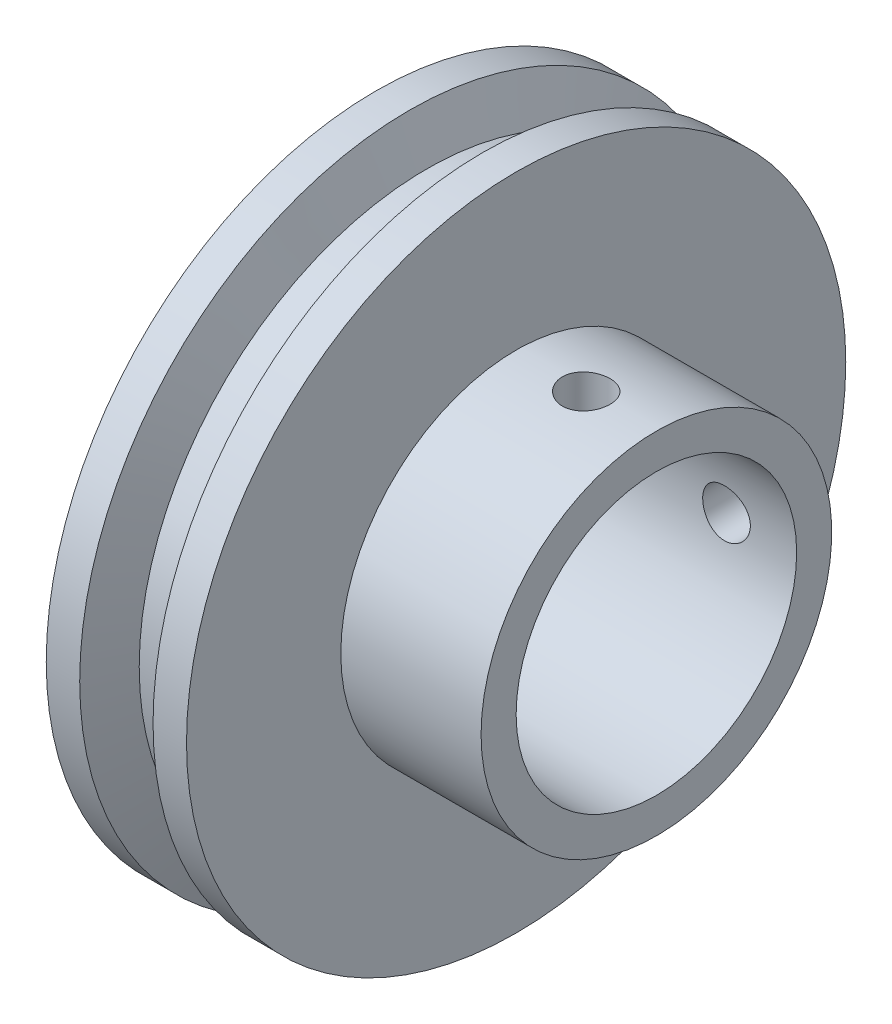
ISO-10303-21;
HEADER;
FILE_DESCRIPTION(('STEP AP214'),'2;1');
FILE_NAME('part.step','',(''),(''),'','','');
FILE_SCHEMA(('AUTOMOTIVE_DESIGN { 1 0 10303 214 1 1 1 1 }'));
ENDSEC;
DATA;
#1=APPLICATION_CONTEXT('core data for automotive mechanical design processes');
#2=APPLICATION_PROTOCOL_DEFINITION('international standard','automotive_design',2000,#1);
#3=PRODUCT_CONTEXT('',#1,'mechanical');
#4=PRODUCT('Part','Part','',(#3));
#5=PRODUCT_RELATED_PRODUCT_CATEGORY('part','',(#4));
#6=PRODUCT_DEFINITION_FORMATION('','',#4);
#7=PRODUCT_DEFINITION_CONTEXT('part definition',#1,'design');
#8=PRODUCT_DEFINITION('design','',#6,#7);
#9=PRODUCT_DEFINITION_SHAPE('','',#8);
#10=(LENGTH_UNIT() NAMED_UNIT(*) SI_UNIT(.MILLI.,.METRE.));
#11=(NAMED_UNIT(*) PLANE_ANGLE_UNIT() SI_UNIT($,.RADIAN.));
#12=(NAMED_UNIT(*) SI_UNIT($,.STERADIAN.) SOLID_ANGLE_UNIT());
#13=UNCERTAINTY_MEASURE_WITH_UNIT(LENGTH_MEASURE(1.E-05),#10,'distance_accuracy_value','');
#14=(GEOMETRIC_REPRESENTATION_CONTEXT(3) GLOBAL_UNCERTAINTY_ASSIGNED_CONTEXT((#13)) GLOBAL_UNIT_ASSIGNED_CONTEXT((#10,
#11,#12)) REPRESENTATION_CONTEXT('',''));
#15=CARTESIAN_POINT('',(0.,0.,0.));
#16=DIRECTION('',(0.,0.,1.));
#17=DIRECTION('',(1.,0.,0.));
#18=AXIS2_PLACEMENT_3D('',#15,#16,#17);
#19=CARTESIAN_POINT('',(-5.,0.,0.));
#20=DIRECTION('',(-1.,0.,0.));
#21=DIRECTION('',(0.,0.,1.));
#22=AXIS2_PLACEMENT_3D('',#19,#20,#21);
#23=CYLINDRICAL_SURFACE('',#22,12.5);
#24=CARTESIAN_POINT('',(5.,0.,0.));
#25=DIRECTION('',(-1.,0.,0.));
#26=DIRECTION('',(0.,0.,1.));
#27=AXIS2_PLACEMENT_3D('',#24,#25,#26);
#28=CIRCLE('',#27,12.5);
#29=CARTESIAN_POINT('',(5.,0.,12.5));
#30=VERTEX_POINT('',#29);
#31=EDGE_CURVE('E81',#30,#30,#28,.T.);
#32=ORIENTED_EDGE('',*,*,#31,.F.);
#33=EDGE_LOOP('',(#32));
#34=FACE_BOUND('',#33,.T.);
#35=CARTESIAN_POINT('',(15.,0.,0.));
#36=DIRECTION('',(-1.,0.,0.));
#37=DIRECTION('',(0.,0.,1.));
#38=AXIS2_PLACEMENT_3D('',#35,#36,#37);
#39=CIRCLE('',#38,12.5);
#40=CARTESIAN_POINT('',(15.,0.,12.5));
#41=VERTEX_POINT('',#40);
#42=EDGE_CURVE('E10',#41,#41,#39,.T.);
#43=ORIENTED_EDGE('',*,*,#42,.T.);
#44=EDGE_LOOP('',(#43));
#45=FACE_BOUND('',#44,.T.);
#46=CARTESIAN_POINT('',(8.3,12.5,0.));
#47=CARTESIAN_POINT('',(8.30000399049848,12.4999985824937,0.0950193693737276));
#48=CARTESIAN_POINT('',(8.30799335860235,12.4989051524507,0.190096346810551));
#49=CARTESIAN_POINT('',(8.33973558100916,12.4946484420949,0.377599668031956));
#50=CARTESIAN_POINT('',(8.36350443099154,12.4914830614891,0.470023222755469));
#51=CARTESIAN_POINT('',(8.42608811753651,12.4834386800685,0.649478453993376));
#52=CARTESIAN_POINT('',(8.46489230343678,12.4785608925101,0.736513896810582));
#53=CARTESIAN_POINT('',(8.55642067336079,12.4676327325641,0.902822437619667));
#54=CARTESIAN_POINT('',(8.60914266070609,12.461582545259,0.982096757862897));
#55=CARTESIAN_POINT('',(8.72737428453399,12.4489401706774,1.1311609905647));
#56=CARTESIAN_POINT('',(8.79295610205747,12.4423450516135,1.20089340927839));
#57=CARTESIAN_POINT('',(8.93489058333537,12.4293794703064,1.32839884646826));
#58=CARTESIAN_POINT('',(9.01124382407019,12.4230090201206,1.38617122388536));
#59=CARTESIAN_POINT('',(9.17293294201966,12.4111854302546,1.48833501602162));
#60=CARTESIAN_POINT('',(9.25830363935377,12.4057360746105,1.53267179858357));
#61=CARTESIAN_POINT('',(9.43536596920943,12.3964109917819,1.60635685826283));
#62=CARTESIAN_POINT('',(9.5270573184181,12.3925351941187,1.63570580669007));
#63=CARTESIAN_POINT('',(9.71355783465852,12.3868244616918,1.67840568904312));
#64=CARTESIAN_POINT('',(9.80834424651759,12.3849770693856,1.69185431515497));
#65=CARTESIAN_POINT('',(9.99884518965241,12.3834943395339,1.70267423628677));
#66=CARTESIAN_POINT('',(10.0945596767459,12.3838588971968,1.70004629293772));
#67=CARTESIAN_POINT('',(10.2835151005745,12.3867474777825,1.6788677145159));
#68=CARTESIAN_POINT('',(10.3767684103706,12.389256838664,1.66042518638892));
#69=CARTESIAN_POINT('',(10.5588443269562,12.3961294042073,1.60830986035059));
#70=CARTESIAN_POINT('',(10.647666828938,12.4004926526983,1.5746367023588));
#71=CARTESIAN_POINT('',(10.8186927336821,12.4105978157081,1.49290135454795));
#72=CARTESIAN_POINT('',(10.900873649633,12.4163441716624,1.44479268408234));
#73=CARTESIAN_POINT('',(11.0560369845013,12.4285647481879,1.33558512659794));
#74=CARTESIAN_POINT('',(11.1290189056233,12.4350390081132,1.27448553706776));
#75=CARTESIAN_POINT('',(11.264339663579,12.4480509280862,1.14043378959507));
#76=CARTESIAN_POINT('',(11.3265863165472,12.4545886726739,1.06738854593132));
#77=CARTESIAN_POINT('',(11.4379501383685,12.4669414130603,0.911838118562529));
#78=CARTESIAN_POINT('',(11.4870672666848,12.4727564066275,0.829332905651349));
#79=CARTESIAN_POINT('',(11.5707797967884,12.483013039657,0.657129787303394));
#80=CARTESIAN_POINT('',(11.6053688667713,12.4874540800839,0.567428765939401));
#81=CARTESIAN_POINT('',(11.6589673436249,12.4944571938052,0.383417754602683));
#82=CARTESIAN_POINT('',(11.6779776148745,12.4970193713461,0.289108020648868));
#83=CARTESIAN_POINT('',(11.6997580896896,12.4999624166332,0.0993531437377582));
#84=CARTESIAN_POINT('',(11.7026551736488,12.5003603259693,0.0039228185657198));
#85=CARTESIAN_POINT('',(11.6924626868127,12.4989761709545,-0.186062088343098));
#86=CARTESIAN_POINT('',(11.6793735206688,12.4971941617827,-0.280616692185505));
#87=CARTESIAN_POINT('',(11.6376855428029,12.4916609697489,-0.465787556296886));
#88=CARTESIAN_POINT('',(11.6091477811237,12.4879175399217,-0.556417812371648));
#89=CARTESIAN_POINT('',(11.537436545087,12.478880270856,-0.731606674242915));
#90=CARTESIAN_POINT('',(11.4942624921698,12.47358637033,-0.816165039862857));
#91=CARTESIAN_POINT('',(11.3942011480688,12.4619950790423,-0.977372840274132));
#92=CARTESIAN_POINT('',(11.3372324452297,12.455691809023,-1.05397131280997));
#93=CARTESIAN_POINT('',(11.211313337348,12.4428038405337,-1.19656515527526));
#94=CARTESIAN_POINT('',(11.1423623653937,12.4362191287592,-1.26256002323669));
#95=CARTESIAN_POINT('',(10.9938745408483,12.4234572170661,-1.38252830907401));
#96=CARTESIAN_POINT('',(10.9142691068428,12.4172830816708,-1.43641721633323));
#97=CARTESIAN_POINT('',(10.7470621534232,12.4060934325306,-1.53005854518823));
#98=CARTESIAN_POINT('',(10.6594608185572,12.4010778920545,-1.56981129294775));
#99=CARTESIAN_POINT('',(10.4790127566732,12.3927947776081,-1.63391747298213));
#100=CARTESIAN_POINT('',(10.3861827355514,12.3895219509384,-1.65831722146991));
#101=CARTESIAN_POINT('',(10.1976952821839,12.3850802367668,-1.69117325627899));
#102=CARTESIAN_POINT('',(10.1020380081,12.3839112317988,-1.69963043274914));
#103=CARTESIAN_POINT('',(9.9114527750082,12.383813359009,-1.700342891897));
#104=CARTESIAN_POINT('',(9.81652529481145,12.3848661289696,-1.69273097999287));
#105=CARTESIAN_POINT('',(9.6293129579314,12.3890535297788,-1.66180397404756));
#106=CARTESIAN_POINT('',(9.53702809980375,12.3921881594894,-1.63848888858925));
#107=CARTESIAN_POINT('',(9.35774624949746,12.4001800965892,-1.57686121095054));
#108=CARTESIAN_POINT('',(9.27074659781941,12.4050365290199,-1.53855623507272));
#109=CARTESIAN_POINT('',(9.10438783045148,12.415926146482,-1.44804917472723));
#110=CARTESIAN_POINT('',(9.02502887946664,12.4219593568718,-1.39584679077453));
#111=CARTESIAN_POINT('',(8.87552693820758,12.4345823449606,-1.27853812678783));
#112=CARTESIAN_POINT('',(8.80546177668758,12.4411761460865,-1.21333308331975));
#113=CARTESIAN_POINT('',(8.6772188219195,12.4541426300155,-1.07207782751908));
#114=CARTESIAN_POINT('',(8.6190438167913,12.4605152606662,-0.996025078592911));
#115=CARTESIAN_POINT('',(8.51600454347844,12.4723535628891,-0.834836006102763));
#116=CARTESIAN_POINT('',(8.47120129412887,12.4778150281094,-0.749660381447641));
#117=CARTESIAN_POINT('',(8.3966005793095,12.4871737590591,-0.572963876241478));
#118=CARTESIAN_POINT('',(8.36678712612197,12.4910726904407,-0.481449875112424));
#119=CARTESIAN_POINT('',(8.32999391075147,12.4959478797449,-0.324573117820288));
#120=CARTESIAN_POINT('',(8.31876278159852,12.4974598558217,-0.260191415281782));
#121=CARTESIAN_POINT('',(8.30376449010305,12.4994863982821,-0.130548868797499));
#122=CARTESIAN_POINT('',(8.29999725811908,12.5000009739719,-0.0652880330601411));
#123=CARTESIAN_POINT('',(8.3,12.5,0.));
#124=B_SPLINE_CURVE_WITH_KNOTS('',3,(#46,#47,#48,#49,#50,#51,#52,#53,#54,#55,#56,#57,#58,#59,
#60,#61,#62,#63,#64,#65,#66,#67,#68,#69,#70,#71,#72,#73,#74,#75,#76,#77,#78,#79,#80,#81,#82,#83,
#84,#85,#86,#87,#88,#89,#90,#91,#92,#93,#94,#95,#96,#97,#98,#99,#100,#101,#102,#103,#104,#105,
#106,#107,#108,#109,#110,#111,#112,#113,#114,#115,#116,#117,#118,#119,#120,#121,#122,#123),
.UNSPECIFIED.,.T.,.F.,(4,2,2,2,2,2,2,2,2,2,2,2,2,2,2,2,2,2,2,2,2,2,2,2,2,2,2,2,2,2,2,2,2,2,2,2,
2,2,4),(0.,0.284819593615374,0.569928350955831,0.854835512412448,1.13969773317749,
1.42620715431877,1.71273192841171,2.00040660874572,2.2880684029073,2.57395345239703,
2.85982495812473,3.14375771237637,3.42769717967764,3.71256089230601,3.9974400134613,
4.28465522208686,4.57187131746729,4.85921246147866,5.14653766148729,5.43159713304084,
5.71664938918519,6.00058330751292,6.2845284508043,6.57019204001725,6.8558691483845,
7.14348251733644,7.43108924975161,7.71782413052424,8.00454300106439,8.2889015208947,
8.57325988530359,8.85747395558084,9.1416941510832,9.42816158283327,9.71469611138848,
10.0025188538507,10.2900339575411,10.4857359988361,10.6814362141364),.UNSPECIFIED.);
#125=CARTESIAN_POINT('',(8.3,12.5,0.));
#126=VERTEX_POINT('',#125);
#127=EDGE_CURVE('E59',#126,#126,#124,.T.);
#128=ORIENTED_EDGE('',*,*,#127,.F.);
#129=EDGE_LOOP('',(#128));
#130=FACE_BOUND('',#129,.T.);
#131=CARTESIAN_POINT('',(8.3,0.,-12.5));
#132=CARTESIAN_POINT('',(8.30000399049848,0.0950193693736839,-12.4999985824937));
#133=CARTESIAN_POINT('',(8.30799335860235,0.190096346810508,-12.4989051524507));
#134=CARTESIAN_POINT('',(8.33973558100916,0.377599668031913,-12.4946484420949));
#135=CARTESIAN_POINT('',(8.36350443099154,0.470023222755425,-12.4914830614891));
#136=CARTESIAN_POINT('',(8.42608811753651,0.649478453993333,-12.4834386800686));
#137=CARTESIAN_POINT('',(8.46489230343678,0.736513896810538,-12.4785608925101));
#138=CARTESIAN_POINT('',(8.55642067336079,0.902822437619623,-12.4676327325641));
#139=CARTESIAN_POINT('',(8.60914266070609,0.982096757862853,-12.461582545259));
#140=CARTESIAN_POINT('',(8.72737428453399,1.13116099056465,-12.4489401706774));
#141=CARTESIAN_POINT('',(8.79295610205747,1.20089340927835,-12.4423450516135));
#142=CARTESIAN_POINT('',(8.93489058333536,1.32839884646821,-12.4293794703064));
#143=CARTESIAN_POINT('',(9.01124382407019,1.38617122388531,-12.4230090201206));
#144=CARTESIAN_POINT('',(9.17293294201966,1.48833501602158,-12.4111854302546));
#145=CARTESIAN_POINT('',(9.25830363935377,1.53267179858353,-12.4057360746105));
#146=CARTESIAN_POINT('',(9.43536596920943,1.60635685826279,-12.3964109917819));
#147=CARTESIAN_POINT('',(9.5270573184181,1.63570580669003,-12.3925351941188));
#148=CARTESIAN_POINT('',(9.71355783465852,1.67840568904308,-12.3868244616918));
#149=CARTESIAN_POINT('',(9.80834424651759,1.69185431515493,-12.3849770693856));
#150=CARTESIAN_POINT('',(9.9988451896524,1.70267423628673,-12.3834943395339));
#151=CARTESIAN_POINT('',(10.0945596767459,1.70004629293768,-12.3838588971968));
#152=CARTESIAN_POINT('',(10.2835151005745,1.67886771451586,-12.3867474777825));
#153=CARTESIAN_POINT('',(10.3767684103706,1.66042518638888,-12.389256838664));
#154=CARTESIAN_POINT('',(10.5588443269562,1.60830986035055,-12.3961294042073));
#155=CARTESIAN_POINT('',(10.647666828938,1.57463670235876,-12.4004926526983));
#156=CARTESIAN_POINT('',(10.8186927336821,1.49290135454791,-12.4105978157081));
#157=CARTESIAN_POINT('',(10.900873649633,1.44479268408229,-12.4163441716624));
#158=CARTESIAN_POINT('',(11.0560369845013,1.33558512659789,-12.4285647481879));
#159=CARTESIAN_POINT('',(11.1290189056233,1.27448553706772,-12.4350390081132));
#160=CARTESIAN_POINT('',(11.264339663579,1.14043378959502,-12.4480509280862));
#161=CARTESIAN_POINT('',(11.3265863165472,1.06738854593127,-12.454588672674));
#162=CARTESIAN_POINT('',(11.4379501383685,0.911838118562487,-12.4669414130603));
#163=CARTESIAN_POINT('',(11.4870672666848,0.829332905651306,-12.4727564066275));
#164=CARTESIAN_POINT('',(11.5707797967884,0.65712978730335,-12.483013039657));
#165=CARTESIAN_POINT('',(11.6053688667713,0.567428765939358,-12.4874540800839));
#166=CARTESIAN_POINT('',(11.6589673436249,0.383417754602639,-12.4944571938052));
#167=CARTESIAN_POINT('',(11.6779776148745,0.289108020648824,-12.4970193713461));
#168=CARTESIAN_POINT('',(11.6997580896896,0.0993531437377132,-12.4999624166332));
#169=CARTESIAN_POINT('',(11.7026551736488,0.00392281856567479,-12.5003603259693));
#170=CARTESIAN_POINT('',(11.6924626868127,-0.186062088343143,-12.4989761709545));
#171=CARTESIAN_POINT('',(11.6793735206688,-0.280616692185549,-12.4971941617827));
#172=CARTESIAN_POINT('',(11.6376855428029,-0.46578755629693,-12.4916609697489));
#173=CARTESIAN_POINT('',(11.6091477811237,-0.556417812371693,-12.4879175399217));
#174=CARTESIAN_POINT('',(11.537436545087,-0.731606674242959,-12.478880270856));
#175=CARTESIAN_POINT('',(11.4942624921698,-0.816165039862902,-12.47358637033));
#176=CARTESIAN_POINT('',(11.3942011480688,-0.977372840274176,-12.4619950790423));
#177=CARTESIAN_POINT('',(11.3372324452297,-1.05397131281001,-12.455691809023));
#178=CARTESIAN_POINT('',(11.211313337348,-1.19656515527531,-12.4428038405337));
#179=CARTESIAN_POINT('',(11.1423623653937,-1.26256002323674,-12.4362191287591));
#180=CARTESIAN_POINT('',(10.9938745408483,-1.38252830907405,-12.4234572170661));
#181=CARTESIAN_POINT('',(10.9142691068428,-1.43641721633328,-12.4172830816708));
#182=CARTESIAN_POINT('',(10.7470621534232,-1.53005854518827,-12.4060934325306));
#183=CARTESIAN_POINT('',(10.6594608185572,-1.56981129294779,-12.4010778920545));
#184=CARTESIAN_POINT('',(10.4790127566732,-1.63391747298217,-12.3927947776081));
#185=CARTESIAN_POINT('',(10.3861827355514,-1.65831722146996,-12.3895219509384));
#186=CARTESIAN_POINT('',(10.1976952821839,-1.69117325627904,-12.3850802367668));
#187=CARTESIAN_POINT('',(10.1020380081,-1.69963043274918,-12.3839112317988));
#188=CARTESIAN_POINT('',(9.9114527750082,-1.70034289189704,-12.383813359009));
#189=CARTESIAN_POINT('',(9.81652529481145,-1.69273097999291,-12.3848661289696));
#190=CARTESIAN_POINT('',(9.6293129579314,-1.6618039740476,-12.3890535297788));
#191=CARTESIAN_POINT('',(9.53702809980375,-1.63848888858929,-12.3921881594894));
#192=CARTESIAN_POINT('',(9.35774624949746,-1.57686121095058,-12.4001800965892));
#193=CARTESIAN_POINT('',(9.27074659781941,-1.53855623507276,-12.4050365290199));
#194=CARTESIAN_POINT('',(9.10438783045148,-1.44804917472727,-12.415926146482));
#195=CARTESIAN_POINT('',(9.02502887946664,-1.39584679077457,-12.4219593568718));
#196=CARTESIAN_POINT('',(8.87552693820758,-1.27853812678787,-12.4345823449606));
#197=CARTESIAN_POINT('',(8.80546177668758,-1.21333308331979,-12.4411761460865));
#198=CARTESIAN_POINT('',(8.6772188219195,-1.07207782751913,-12.4541426300155));
#199=CARTESIAN_POINT('',(8.6190438167913,-0.996025078592954,-12.4605152606662));
#200=CARTESIAN_POINT('',(8.51600454347844,-0.834836006102806,-12.4723535628891));
#201=CARTESIAN_POINT('',(8.47120129412887,-0.749660381447683,-12.4778150281094));
#202=CARTESIAN_POINT('',(8.3966005793095,-0.57296387624152,-12.4871737590591));
#203=CARTESIAN_POINT('',(8.36678712612197,-0.481449875112467,-12.4910726904407));
#204=CARTESIAN_POINT('',(8.32999391075147,-0.324573117820331,-12.4959478797449));
#205=CARTESIAN_POINT('',(8.31876278159852,-0.260191415281826,-12.4974598558216));
#206=CARTESIAN_POINT('',(8.30376449010305,-0.130548868797543,-12.4994863982821));
#207=CARTESIAN_POINT('',(8.29999725811908,-0.0652880330601849,-12.5000009739719));
#208=CARTESIAN_POINT('',(8.3,0.,-12.5));
#209=B_SPLINE_CURVE_WITH_KNOTS('',3,(#131,#132,#133,#134,#135,#136,#137,#138,#139,#140,#141,
#142,#143,#144,#145,#146,#147,#148,#149,#150,#151,#152,#153,#154,#155,#156,#157,#158,#159,#160,
#161,#162,#163,#164,#165,#166,#167,#168,#169,#170,#171,#172,#173,#174,#175,#176,#177,#178,#179,
#180,#181,#182,#183,#184,#185,#186,#187,#188,#189,#190,#191,#192,#193,#194,#195,#196,#197,#198,
#199,#200,#201,#202,#203,#204,#205,#206,#207,#208),.UNSPECIFIED.,.T.,.F.,(4,2,2,2,2,2,2,2,2,2,2,
2,2,2,2,2,2,2,2,2,2,2,2,2,2,2,2,2,2,2,2,2,2,2,2,2,2,2,4),(0.,0.284819593615374,0.56992835095583,
0.854835512412448,1.13969773317749,1.42620715431877,1.71273192841171,2.00040660874572,
2.2880684029073,2.57395345239702,2.85982495812473,3.14375771237638,3.42769717967765,
3.71256089230601,3.9974400134613,4.28465522208686,4.57187131746729,4.85921246147867,
5.14653766148729,5.43159713304084,5.71664938918519,6.00058330751292,6.2845284508043,
6.57019204001726,6.8558691483845,7.14348251733644,7.43108924975162,7.71782413052424,
8.00454300106439,8.28890152089471,8.5732598853036,8.85747395558085,9.1416941510832,
9.42816158283327,9.71469611138848,10.0025188538507,10.2900339575411,10.4857359988361,
10.6814362141364),.UNSPECIFIED.);
#210=CARTESIAN_POINT('',(8.3,0.,-12.5));
#211=VERTEX_POINT('',#210);
#212=EDGE_CURVE('E60',#211,#211,#209,.T.);
#213=ORIENTED_EDGE('',*,*,#212,.F.);
#214=EDGE_LOOP('',(#213));
#215=FACE_BOUND('',#214,.T.);
#216=ADVANCED_FACE('F32',(#34,#45,#130,#215),#23,.T.);
#217=CARTESIAN_POINT('',(-5.,0.,0.));
#218=DIRECTION('',(-1.,0.,0.));
#219=DIRECTION('',(0.,0.,1.));
#220=AXIS2_PLACEMENT_3D('',#217,#218,#219);
#221=CYLINDRICAL_SURFACE('',#220,10.);
#222=CARTESIAN_POINT('',(15.,0.,0.));
#223=DIRECTION('',(-1.,0.,0.));
#224=DIRECTION('',(0.,0.,1.));
#225=AXIS2_PLACEMENT_3D('',#222,#223,#224);
#226=CIRCLE('',#225,10.);
#227=CARTESIAN_POINT('',(15.,0.,10.));
#228=VERTEX_POINT('',#227);
#229=EDGE_CURVE('E45',#228,#228,#226,.T.);
#230=ORIENTED_EDGE('',*,*,#229,.F.);
#231=EDGE_LOOP('',(#230));
#232=FACE_BOUND('',#231,.T.);
#233=CARTESIAN_POINT('',(-5.,0.,0.));
#234=DIRECTION('',(-1.,0.,0.));
#235=DIRECTION('',(0.,0.,1.));
#236=AXIS2_PLACEMENT_3D('',#233,#234,#235);
#237=CIRCLE('',#236,10.);
#238=CARTESIAN_POINT('',(-5.,0.,10.));
#239=VERTEX_POINT('',#238);
#240=EDGE_CURVE('E50',#239,#239,#237,.T.);
#241=ORIENTED_EDGE('',*,*,#240,.T.);
#242=EDGE_LOOP('',(#241));
#243=FACE_BOUND('',#242,.T.);
#244=CARTESIAN_POINT('',(8.3,10.,0.));
#245=CARTESIAN_POINT('',(8.30000377426823,9.99999835850477,-0.0947576878946056));
#246=CARTESIAN_POINT('',(8.3079494293732,9.99863913653262,-0.189566391791717));
#247=CARTESIAN_POINT('',(8.33950779581301,9.99334783512617,-0.376522793597835));
#248=CARTESIAN_POINT('',(8.36313473363319,9.98941341945108,-0.468667995816794));
#249=CARTESIAN_POINT('',(8.4253200785672,9.97941284762061,-0.647565634171713));
#250=CARTESIAN_POINT('',(8.46386607640266,9.97334846350343,-0.734322482783481));
#251=CARTESIAN_POINT('',(8.55476244084402,9.95975405257941,-0.900126684803734));
#252=CARTESIAN_POINT('',(8.60711129965871,9.95222418588187,-0.979174878995802));
#253=CARTESIAN_POINT('',(8.72468015800242,9.93644939291957,-1.12811339489271));
#254=CARTESIAN_POINT('',(8.79001042782126,9.92819870569956,-1.19791607072673));
#255=CARTESIAN_POINT('',(8.93145028967449,9.91195606359551,-1.32562484199451));
#256=CARTESIAN_POINT('',(9.00756057528767,9.90396412539988,-1.38353017137327));
#257=CARTESIAN_POINT('',(9.16900471159843,9.88908804024087,-1.48615381918915));
#258=CARTESIAN_POINT('',(9.25439464291669,9.88221133503736,-1.53078508643947));
#259=CARTESIAN_POINT('',(9.43159610594252,9.87042444664235,-1.60503692511557));
#260=CARTESIAN_POINT('',(9.52340718532692,9.86551412509698,-1.63465855265173));
#261=CARTESIAN_POINT('',(9.70991431831559,9.85827341734443,-1.67777332304485));
#262=CARTESIAN_POINT('',(9.80457437839511,9.85591880382118,-1.69141802151836));
#263=CARTESIAN_POINT('',(9.99486742648253,9.85398286044504,-1.70266159018217));
#264=CARTESIAN_POINT('',(10.0905003423385,9.8544013264024,-1.70026164178552));
#265=CARTESIAN_POINT('',(10.2789401126245,9.85794215005271,-1.67960740432418));
#266=CARTESIAN_POINT('',(10.3717662886004,9.86103541731158,-1.66152368158915));
#267=CARTESIAN_POINT('',(10.553047603891,9.86953175017027,-1.6102830462488));
#268=CARTESIAN_POINT('',(10.641502587653,9.87493489790323,-1.57712559765967));
#269=CARTESIAN_POINT('',(10.8120394633763,9.88747346302157,-1.49650673760764));
#270=CARTESIAN_POINT('',(10.8940873626616,9.89461738721263,-1.44897479731416));
#271=CARTESIAN_POINT('',(11.0491073586138,9.90982670315991,-1.34100625557331));
#272=CARTESIAN_POINT('',(11.1220786930608,9.91789217219545,-1.2805685715006));
#273=CARTESIAN_POINT('',(11.2578612153225,9.93416346380999,-1.14757629513502));
#274=CARTESIAN_POINT('',(11.320529165259,9.94236975461281,-1.07487542689003));
#275=CARTESIAN_POINT('',(11.4327985550483,9.95790194047775,-0.91991440278867));
#276=CARTESIAN_POINT('',(11.482399904278,9.96522782943365,-0.837654180639252));
#277=CARTESIAN_POINT('',(11.5671423471008,9.97818481552786,-0.665772592595595));
#278=CARTESIAN_POINT('',(11.6022704457055,9.98381438839473,-0.576144697761933));
#279=CARTESIAN_POINT('',(11.6569344968132,9.99273228163516,-0.392144072691742));
#280=CARTESIAN_POINT('',(11.6764718070531,9.9960208058782,-0.297771756388137));
#281=CARTESIAN_POINT('',(11.6992047217622,9.99985857062862,-0.108195402995362));
#282=CARTESIAN_POINT('',(11.7025969038369,10.0004407604978,-0.0130155823423568));
#283=CARTESIAN_POINT('',(11.6934678440613,9.99889062262385,0.176552208617399));
#284=CARTESIAN_POINT('',(11.6809472401301,9.99675840369713,0.270940210514254));
#285=CARTESIAN_POINT('',(11.6405115192946,9.9900394441558,0.455635354346481));
#286=CARTESIAN_POINT('',(11.612694051989,9.98546827833647,0.545964490519939));
#287=CARTESIAN_POINT('',(11.5425585774746,9.97438190041171,0.720677070626036));
#288=CARTESIAN_POINT('',(11.5002397288841,9.96786657550744,0.805060169222212));
#289=CARTESIAN_POINT('',(11.4018548591597,9.95353279680435,0.966336947941809));
#290=CARTESIAN_POINT('',(11.3456664517532,9.94570295183439,1.04315493575005));
#291=CARTESIAN_POINT('',(11.2213053793328,9.92964218696026,1.18634178293015));
#292=CARTESIAN_POINT('',(11.1531318063952,9.92141123670495,1.25270984995668));
#293=CARTESIAN_POINT('',(11.0058526439188,9.90536897279411,1.37384438851324));
#294=CARTESIAN_POINT('',(10.9266369481539,9.89756315078007,1.42847783237172));
#295=CARTESIAN_POINT('',(10.7600369358385,9.88335868818869,1.52366227424996));
#296=CARTESIAN_POINT('',(10.6726528858138,9.87696000172068,1.56421373154811));
#297=CARTESIAN_POINT('',(10.4925634017548,9.86633579141612,1.62988570006916));
#298=CARTESIAN_POINT('',(10.3998823886925,9.86210106805335,1.65507162400974));
#299=CARTESIAN_POINT('',(10.2115270724541,9.85626147937876,1.68950285881336));
#300=CARTESIAN_POINT('',(10.1158530418926,9.8546563752585,1.69874961719307));
#301=CARTESIAN_POINT('',(9.92555649227636,9.85426833565764,1.70099842807247));
#302=CARTESIAN_POINT('',(9.83093645764805,9.85544901199148,1.69420993359398));
#303=CARTESIAN_POINT('',(9.64420600021117,9.86041960844602,1.66503470775952));
#304=CARTESIAN_POINT('',(9.55209556830815,9.86420951910991,1.64264803293704));
#305=CARTESIAN_POINT('',(9.37308483455114,9.87395749749249,1.5829934295977));
#306=CARTESIAN_POINT('',(9.28617812738393,9.87991283309771,1.54574424734568));
#307=CARTESIAN_POINT('',(9.11981367766731,9.893323172577,1.45744370457911));
#308=CARTESIAN_POINT('',(9.0403563292574,9.90077825573591,1.40639161431834));
#309=CARTESIAN_POINT('',(8.89008922946276,9.91646308896847,1.29118985102456));
#310=CARTESIAN_POINT('',(8.81939828755894,9.92470126313323,1.22688632923809));
#311=CARTESIAN_POINT('',(8.68973876498284,9.94095750314495,1.08733098491411));
#312=CARTESIAN_POINT('',(8.63077289037744,9.94897551781341,1.01207664192477));
#313=CARTESIAN_POINT('',(8.52584704213854,9.96395520458386,0.852109586538184));
#314=CARTESIAN_POINT('',(8.47998397145125,9.9709088381394,0.767332551982329));
#315=CARTESIAN_POINT('',(8.40322128664598,9.98289805427614,0.591192591150799));
#316=CARTESIAN_POINT('',(8.37230689784042,9.98793552965722,0.499836270638973));
#317=CARTESIAN_POINT('',(8.33296367751762,9.99443647001914,0.340114573147608));
#318=CARTESIAN_POINT('',(8.32062229455269,9.99651154722548,0.272710808068802));
#319=CARTESIAN_POINT('',(8.30413916773769,9.99929389258055,0.136880224020146));
#320=CARTESIAN_POINT('',(8.29999727344991,10.0000011858243,0.06845342384334));
#321=CARTESIAN_POINT('',(8.3,10.,0.));
#322=B_SPLINE_CURVE_WITH_KNOTS('',3,(#244,#245,#246,#247,#248,#249,#250,#251,#252,#253,#254,
#255,#256,#257,#258,#259,#260,#261,#262,#263,#264,#265,#266,#267,#268,#269,#270,#271,#272,#273,
#274,#275,#276,#277,#278,#279,#280,#281,#282,#283,#284,#285,#286,#287,#288,#289,#290,#291,#292,
#293,#294,#295,#296,#297,#298,#299,#300,#301,#302,#303,#304,#305,#306,#307,#308,#309,#310,#311,
#312,#313,#314,#315,#316,#317,#318,#319,#320,#321),.UNSPECIFIED.,.T.,.F.,(4,2,2,2,2,2,2,2,2,2,2,
2,2,2,2,2,2,2,2,2,2,2,2,2,2,2,2,2,2,2,2,2,2,2,2,2,2,2,4),(0.,0.284022828438538,
0.568303682958859,0.852348586605788,1.13636247471906,1.42290084405775,1.70945765745934,
1.99785424638948,2.28623054029933,2.57184857573334,2.85744558052974,3.1399750242267,
3.42251451474645,3.70646342600059,3.99043616626787,4.27807283462104,4.56571149782111,
4.85360786111795,5.14147914998386,5.42583629106419,5.71018203306509,5.99273333952095,
6.27530104260756,6.56045734817343,6.8456352647715,7.13389286809598,7.42214106913036,
7.70915344460832,7.99613975365976,8.27939820754209,8.56265563479787,8.84555690967837,
9.12847314419731,9.41488053086676,9.70135394191366,9.98989417240833,10.2781486352408,
10.4833319001627,10.6885114005101),.UNSPECIFIED.);
#323=CARTESIAN_POINT('',(8.3,10.,0.));
#324=VERTEX_POINT('',#323);
#325=EDGE_CURVE('E53',#324,#324,#322,.T.);
#326=ORIENTED_EDGE('',*,*,#325,.F.);
#327=EDGE_LOOP('',(#326));
#328=FACE_BOUND('',#327,.T.);
#329=CARTESIAN_POINT('',(8.3,0.,-10.));
#330=CARTESIAN_POINT('',(8.30000377426823,-0.0947576878946406,-9.99999835850477));
#331=CARTESIAN_POINT('',(8.3079494293732,-0.189566391791752,-9.99863913653262));
#332=CARTESIAN_POINT('',(8.33950779581302,-0.37652279359787,-9.99334783512617));
#333=CARTESIAN_POINT('',(8.36313473363319,-0.468667995816829,-9.98941341945108));
#334=CARTESIAN_POINT('',(8.4253200785672,-0.647565634171748,-9.9794128476206));
#335=CARTESIAN_POINT('',(8.46386607640266,-0.734322482783516,-9.97334846350343));
#336=CARTESIAN_POINT('',(8.55476244084402,-0.900126684803768,-9.95975405257941));
#337=CARTESIAN_POINT('',(8.60711129965871,-0.979174878995837,-9.95222418588187));
#338=CARTESIAN_POINT('',(8.72468015800242,-1.12811339489274,-9.93644939291956));
#339=CARTESIAN_POINT('',(8.79001042782126,-1.19791607072676,-9.92819870569956));
#340=CARTESIAN_POINT('',(8.93145028967449,-1.32562484199454,-9.91195606359551));
#341=CARTESIAN_POINT('',(9.00756057528767,-1.38353017137331,-9.90396412539988));
#342=CARTESIAN_POINT('',(9.16900471159843,-1.48615381918918,-9.88908804024087));
#343=CARTESIAN_POINT('',(9.25439464291669,-1.53078508643951,-9.88221133503736));
#344=CARTESIAN_POINT('',(9.43159610594252,-1.6050369251156,-9.87042444664234));
#345=CARTESIAN_POINT('',(9.52340718532692,-1.63465855265176,-9.86551412509698));
#346=CARTESIAN_POINT('',(9.70991431831559,-1.67777332304488,-9.85827341734443));
#347=CARTESIAN_POINT('',(9.80457437839511,-1.69141802151839,-9.85591880382117));
#348=CARTESIAN_POINT('',(9.99486742648253,-1.70266159018221,-9.85398286044503));
#349=CARTESIAN_POINT('',(10.0905003423385,-1.70026164178555,-9.8544013264024));
#350=CARTESIAN_POINT('',(10.2789401126245,-1.67960740432421,-9.8579421500527));
#351=CARTESIAN_POINT('',(10.3717662886004,-1.66152368158919,-9.86103541731157));
#352=CARTESIAN_POINT('',(10.553047603891,-1.61028304624884,-9.86953175017027));
#353=CARTESIAN_POINT('',(10.641502587653,-1.57712559765971,-9.87493489790323));
#354=CARTESIAN_POINT('',(10.8120394633763,-1.49650673760767,-9.88747346302157));
#355=CARTESIAN_POINT('',(10.8940873626616,-1.44897479731419,-9.89461738721263));
#356=CARTESIAN_POINT('',(11.0491073586138,-1.34100625557335,-9.90982670315991));
#357=CARTESIAN_POINT('',(11.1220786930608,-1.28056857150064,-9.91789217219545));
#358=CARTESIAN_POINT('',(11.2578612153225,-1.14757629513505,-9.93416346380998));
#359=CARTESIAN_POINT('',(11.320529165259,-1.07487542689007,-9.94236975461281));
#360=CARTESIAN_POINT('',(11.4327985550483,-0.919914402788705,-9.95790194047774));
#361=CARTESIAN_POINT('',(11.482399904278,-0.837654180639287,-9.96522782943365));
#362=CARTESIAN_POINT('',(11.5671423471008,-0.665772592595631,-9.97818481552786));
#363=CARTESIAN_POINT('',(11.6022704457055,-0.576144697761967,-9.98381438839473));
#364=CARTESIAN_POINT('',(11.6569344968132,-0.392144072691777,-9.99273228163516));
#365=CARTESIAN_POINT('',(11.6764718070531,-0.297771756388172,-9.9960208058782));
#366=CARTESIAN_POINT('',(11.6992047217622,-0.108195402995397,-9.99985857062862));
#367=CARTESIAN_POINT('',(11.7025969038369,-0.0130155823423929,-10.0004407604978));
#368=CARTESIAN_POINT('',(11.6934678440613,0.176552208617363,-9.99889062262385));
#369=CARTESIAN_POINT('',(11.6809472401301,0.270940210514219,-9.99675840369713));
#370=CARTESIAN_POINT('',(11.6405115192946,0.455635354346445,-9.99003944415581));
#371=CARTESIAN_POINT('',(11.612694051989,0.545964490519902,-9.98546827833648));
#372=CARTESIAN_POINT('',(11.5425585774746,0.720677070626,-9.97438190041171));
#373=CARTESIAN_POINT('',(11.5002397288841,0.805060169222177,-9.96786657550744));
#374=CARTESIAN_POINT('',(11.4018548591597,0.966336947941773,-9.95353279680435));
#375=CARTESIAN_POINT('',(11.3456664517532,1.04315493575002,-9.94570295183439));
#376=CARTESIAN_POINT('',(11.2213053793328,1.18634178293012,-9.92964218696026));
#377=CARTESIAN_POINT('',(11.1531318063952,1.25270984995664,-9.92141123670496));
#378=CARTESIAN_POINT('',(11.0058526439188,1.37384438851321,-9.90536897279412));
#379=CARTESIAN_POINT('',(10.9266369481539,1.42847783237168,-9.89756315078008));
#380=CARTESIAN_POINT('',(10.7600369358385,1.52366227424992,-9.88335868818869));
#381=CARTESIAN_POINT('',(10.6726528858138,1.56421373154807,-9.87696000172068));
#382=CARTESIAN_POINT('',(10.4925634017548,1.62988570006912,-9.86633579141612));
#383=CARTESIAN_POINT('',(10.3998823886925,1.6550716240097,-9.86210106805335));
#384=CARTESIAN_POINT('',(10.2115270724541,1.68950285881333,-9.85626147937876));
#385=CARTESIAN_POINT('',(10.1158530418926,1.69874961719303,-9.85465637525851));
#386=CARTESIAN_POINT('',(9.92555649227636,1.70099842807243,-9.85426833565765));
#387=CARTESIAN_POINT('',(9.83093645764805,1.69420993359395,-9.85544901199149));
#388=CARTESIAN_POINT('',(9.64420600021117,1.66503470775949,-9.86041960844603));
#389=CARTESIAN_POINT('',(9.55209556830815,1.642648032937,-9.86420951910992));
#390=CARTESIAN_POINT('',(9.37308483455114,1.58299342959766,-9.8739574974925));
#391=CARTESIAN_POINT('',(9.28617812738393,1.54574424734565,-9.87991283309772));
#392=CARTESIAN_POINT('',(9.11981367766731,1.45744370457907,-9.893323172577));
#393=CARTESIAN_POINT('',(9.0403563292574,1.40639161431831,-9.90077825573591));
#394=CARTESIAN_POINT('',(8.89008922946276,1.29118985102452,-9.91646308896848));
#395=CARTESIAN_POINT('',(8.81939828755894,1.22688632923806,-9.92470126313324));
#396=CARTESIAN_POINT('',(8.68973876498284,1.08733098491407,-9.94095750314496));
#397=CARTESIAN_POINT('',(8.63077289037744,1.01207664192473,-9.94897551781341));
#398=CARTESIAN_POINT('',(8.52584704213854,0.852109586538149,-9.96395520458386));
#399=CARTESIAN_POINT('',(8.47998397145125,0.767332551982295,-9.9709088381394));
#400=CARTESIAN_POINT('',(8.40322128664598,0.591192591150765,-9.98289805427614));
#401=CARTESIAN_POINT('',(8.37230689784042,0.499836270638939,-9.98793552965722));
#402=CARTESIAN_POINT('',(8.33296367751762,0.340114573147574,-9.99443647001914));
#403=CARTESIAN_POINT('',(8.32062229455269,0.272710808068768,-9.99651154722548));
#404=CARTESIAN_POINT('',(8.30413916773769,0.136880224020111,-9.99929389258055));
#405=CARTESIAN_POINT('',(8.29999727344991,0.0684534238433049,-10.0000011858243));
#406=CARTESIAN_POINT('',(8.3,0.,-10.));
#407=B_SPLINE_CURVE_WITH_KNOTS('',3,(#329,#330,#331,#332,#333,#334,#335,#336,#337,#338,#339,
#340,#341,#342,#343,#344,#345,#346,#347,#348,#349,#350,#351,#352,#353,#354,#355,#356,#357,#358,
#359,#360,#361,#362,#363,#364,#365,#366,#367,#368,#369,#370,#371,#372,#373,#374,#375,#376,#377,
#378,#379,#380,#381,#382,#383,#384,#385,#386,#387,#388,#389,#390,#391,#392,#393,#394,#395,#396,
#397,#398,#399,#400,#401,#402,#403,#404,#405,#406),.UNSPECIFIED.,.T.,.F.,(4,2,2,2,2,2,2,2,2,2,2,
2,2,2,2,2,2,2,2,2,2,2,2,2,2,2,2,2,2,2,2,2,2,2,2,2,2,2,4),(0.,0.284022828438539,
0.568303682958859,0.852348586605787,1.13636247471906,1.42290084405775,1.70945765745934,
1.99785424638948,2.28623054029933,2.57184857573334,2.85744558052973,3.1399750242267,
3.42251451474645,3.70646342600059,3.99043616626787,4.27807283462103,4.56571149782111,
4.85360786111795,5.14147914998386,5.42583629106418,5.71018203306508,5.99273333952094,
6.27530104260756,6.56045734817343,6.8456352647715,7.13389286809598,7.42214106913036,
7.70915344460832,7.99613975365976,8.27939820754209,8.56265563479787,8.84555690967837,
9.12847314419731,9.41488053086676,9.70135394191366,9.98989417240834,10.2781486352408,
10.4833319001627,10.6885114005101),.UNSPECIFIED.);
#408=CARTESIAN_POINT('',(8.3,0.,-10.));
#409=VERTEX_POINT('',#408);
#410=EDGE_CURVE('E36',#409,#409,#407,.T.);
#411=ORIENTED_EDGE('',*,*,#410,.F.);
#412=EDGE_LOOP('',(#411));
#413=FACE_BOUND('',#412,.T.);
#414=ADVANCED_FACE('F61',(#232,#243,#328,#413),#221,.F.);
#415=CARTESIAN_POINT('',(15.,12.5,0.));
#416=DIRECTION('',(-1.,0.,0.));
#417=DIRECTION('',(0.,0.,1.));
#418=AXIS2_PLACEMENT_3D('',#415,#416,#417);
#419=PLANE('',#418);
#420=ORIENTED_EDGE('',*,*,#42,.F.);
#421=EDGE_LOOP('',(#420));
#422=FACE_BOUND('',#421,.T.);
#423=ORIENTED_EDGE('',*,*,#229,.T.);
#424=EDGE_LOOP('',(#423));
#425=FACE_BOUND('',#424,.T.);
#426=ADVANCED_FACE('F113',(#422,#425),#419,.F.);
#427=CARTESIAN_POINT('',(-5.,23.5,0.));
#428=DIRECTION('',(1.,0.,0.));
#429=DIRECTION('',(0.,0.,-1.));
#430=AXIS2_PLACEMENT_3D('',#427,#428,#429);
#431=PLANE('',#430);
#432=ORIENTED_EDGE('',*,*,#240,.F.);
#433=EDGE_LOOP('',(#432));
#434=FACE_BOUND('',#433,.T.);
#435=CARTESIAN_POINT('',(-5.,0.,0.));
#436=DIRECTION('',(-1.,0.,0.));
#437=DIRECTION('',(0.,0.,1.));
#438=AXIS2_PLACEMENT_3D('',#435,#436,#437);
#439=CIRCLE('',#438,23.5);
#440=CARTESIAN_POINT('',(-5.,0.,23.5));
#441=VERTEX_POINT('',#440);
#442=EDGE_CURVE('E102',#441,#441,#439,.T.);
#443=ORIENTED_EDGE('',*,*,#442,.T.);
#444=EDGE_LOOP('',(#443));
#445=FACE_BOUND('',#444,.T.);
#446=ADVANCED_FACE('F109',(#434,#445),#431,.F.);
#447=CARTESIAN_POINT('',(-5.,0.,0.));
#448=DIRECTION('',(-1.,0.,0.));
#449=DIRECTION('',(0.,0.,1.));
#450=AXIS2_PLACEMENT_3D('',#447,#448,#449);
#451=CYLINDRICAL_SURFACE('',#450,23.5);
#452=ORIENTED_EDGE('',*,*,#442,.F.);
#453=EDGE_LOOP('',(#452));
#454=FACE_BOUND('',#453,.T.);
#455=CARTESIAN_POINT('',(-2.61421356237309,0.,0.));
#456=DIRECTION('',(-1.,0.,0.));
#457=DIRECTION('',(0.,0.,1.));
#458=AXIS2_PLACEMENT_3D('',#455,#456,#457);
#459=CIRCLE('',#458,23.5);
#460=CARTESIAN_POINT('',(-2.61421356237309,0.,23.5));
#461=VERTEX_POINT('',#460);
#462=EDGE_CURVE('E99',#461,#461,#459,.T.);
#463=ORIENTED_EDGE('',*,*,#462,.T.);
#464=EDGE_LOOP('',(#463));
#465=FACE_BOUND('',#464,.T.);
#466=ADVANCED_FACE('F112',(#454,#465),#451,.T.);
#467=CARTESIAN_POINT('',(-1.37157287525382,0.,0.));
#468=DIRECTION('',(-1.,0.,0.));
#469=DIRECTION('',(0.,0.,1.));
#470=AXIS2_PLACEMENT_3D('',#467,#468,#469);
#471=CONICAL_SURFACE('',#470,20.5,1.17809724509618);
#472=ORIENTED_EDGE('',*,*,#462,.F.);
#473=EDGE_LOOP('',(#472));
#474=FACE_BOUND('',#473,.T.);
#475=CARTESIAN_POINT('',(-1.37157287525382,0.,0.));
#476=DIRECTION('',(-1.,0.,0.));
#477=DIRECTION('',(0.,0.,1.));
#478=AXIS2_PLACEMENT_3D('',#475,#476,#477);
#479=CIRCLE('',#478,20.5);
#480=CARTESIAN_POINT('',(-1.37157287525382,0.,20.5));
#481=VERTEX_POINT('',#480);
#482=EDGE_CURVE('E96',#481,#481,#479,.T.);
#483=ORIENTED_EDGE('',*,*,#482,.T.);
#484=EDGE_LOOP('',(#483));
#485=FACE_BOUND('',#484,.T.);
#486=ADVANCED_FACE('F118',(#474,#485),#471,.T.);
#487=CARTESIAN_POINT('',(-5.,0.,0.));
#488=DIRECTION('',(-1.,0.,0.));
#489=DIRECTION('',(0.,0.,1.));
#490=AXIS2_PLACEMENT_3D('',#487,#488,#489);
#491=CYLINDRICAL_SURFACE('',#490,20.5);
#492=ORIENTED_EDGE('',*,*,#482,.F.);
#493=EDGE_LOOP('',(#492));
#494=FACE_BOUND('',#493,.T.);
#495=CARTESIAN_POINT('',(1.37157287525382,0.,0.));
#496=DIRECTION('',(-1.,0.,0.));
#497=DIRECTION('',(0.,0.,1.));
#498=AXIS2_PLACEMENT_3D('',#495,#496,#497);
#499=CIRCLE('',#498,20.5);
#500=CARTESIAN_POINT('',(1.37157287525382,0.,20.5));
#501=VERTEX_POINT('',#500);
#502=EDGE_CURVE('E93',#501,#501,#499,.T.);
#503=ORIENTED_EDGE('',*,*,#502,.T.);
#504=EDGE_LOOP('',(#503));
#505=FACE_BOUND('',#504,.T.);
#506=ADVANCED_FACE('F124',(#494,#505),#491,.T.);
#507=CARTESIAN_POINT('',(2.61421356237309,0.,0.));
#508=DIRECTION('',(1.,0.,0.));
#509=DIRECTION('',(0.,0.,-1.));
#510=AXIS2_PLACEMENT_3D('',#507,#508,#509);
#511=CONICAL_SURFACE('',#510,23.5,1.17809724509618);
#512=ORIENTED_EDGE('',*,*,#502,.F.);
#513=EDGE_LOOP('',(#512));
#514=FACE_BOUND('',#513,.T.);
#515=CARTESIAN_POINT('',(2.61421356237309,0.,0.));
#516=DIRECTION('',(-1.,0.,0.));
#517=DIRECTION('',(0.,0.,1.));
#518=AXIS2_PLACEMENT_3D('',#515,#516,#517);
#519=CIRCLE('',#518,23.5);
#520=CARTESIAN_POINT('',(2.61421356237309,0.,23.5));
#521=VERTEX_POINT('',#520);
#522=EDGE_CURVE('E90',#521,#521,#519,.T.);
#523=ORIENTED_EDGE('',*,*,#522,.T.);
#524=EDGE_LOOP('',(#523));
#525=FACE_BOUND('',#524,.T.);
#526=ADVANCED_FACE('F130',(#514,#525),#511,.T.);
#527=CARTESIAN_POINT('',(-5.,0.,0.));
#528=DIRECTION('',(-1.,0.,0.));
#529=DIRECTION('',(0.,0.,1.));
#530=AXIS2_PLACEMENT_3D('',#527,#528,#529);
#531=CYLINDRICAL_SURFACE('',#530,23.5);
#532=ORIENTED_EDGE('',*,*,#522,.F.);
#533=EDGE_LOOP('',(#532));
#534=FACE_BOUND('',#533,.T.);
#535=CARTESIAN_POINT('',(5.,0.,0.));
#536=DIRECTION('',(-1.,0.,0.));
#537=DIRECTION('',(0.,0.,1.));
#538=AXIS2_PLACEMENT_3D('',#535,#536,#537);
#539=CIRCLE('',#538,23.5);
#540=CARTESIAN_POINT('',(5.,0.,23.5));
#541=VERTEX_POINT('',#540);
#542=EDGE_CURVE('E87',#541,#541,#539,.T.);
#543=ORIENTED_EDGE('',*,*,#542,.T.);
#544=EDGE_LOOP('',(#543));
#545=FACE_BOUND('',#544,.T.);
#546=ADVANCED_FACE('F136',(#534,#545),#531,.T.);
#547=CARTESIAN_POINT('',(5.,23.5,0.));
#548=DIRECTION('',(-1.,0.,0.));
#549=DIRECTION('',(0.,0.,1.));
#550=AXIS2_PLACEMENT_3D('',#547,#548,#549);
#551=PLANE('',#550);
#552=ORIENTED_EDGE('',*,*,#542,.F.);
#553=EDGE_LOOP('',(#552));
#554=FACE_BOUND('',#553,.T.);
#555=ORIENTED_EDGE('',*,*,#31,.T.);
#556=EDGE_LOOP('',(#555));
#557=FACE_BOUND('',#556,.T.);
#558=ADVANCED_FACE('F69',(#554,#557),#551,.F.);
#559=CARTESIAN_POINT('',(10.,23.5,0.));
#560=DIRECTION('',(0.,1.,0.));
#561=DIRECTION('',(-1.,0.,0.));
#562=AXIS2_PLACEMENT_3D('',#559,#560,#561);
#563=CYLINDRICAL_SURFACE('',#562,1.7);
#564=ORIENTED_EDGE('',*,*,#325,.T.);
#565=EDGE_LOOP('',(#564));
#566=FACE_BOUND('',#565,.T.);
#567=ORIENTED_EDGE('',*,*,#127,.T.);
#568=EDGE_LOOP('',(#567));
#569=FACE_BOUND('',#568,.T.);
#570=ADVANCED_FACE('F64',(#566,#569),#563,.F.);
#571=CARTESIAN_POINT('',(10.,0.,-23.5));
#572=DIRECTION('',(0.,0.,-1.));
#573=DIRECTION('',(-1.,0.,0.));
#574=AXIS2_PLACEMENT_3D('',#571,#572,#573);
#575=CYLINDRICAL_SURFACE('',#574,1.7);
#576=ORIENTED_EDGE('',*,*,#410,.T.);
#577=EDGE_LOOP('',(#576));
#578=FACE_BOUND('',#577,.T.);
#579=ORIENTED_EDGE('',*,*,#212,.T.);
#580=EDGE_LOOP('',(#579));
#581=FACE_BOUND('',#580,.T.);
#582=ADVANCED_FACE('F68',(#578,#581),#575,.F.);
#583=CLOSED_SHELL('',(#216,#414,#426,#446,#466,#486,#506,#526,#546,#558,#570,#582));
#584=MANIFOLD_SOLID_BREP('B2',#583);
#585=ADVANCED_BREP_SHAPE_REPRESENTATION('',(#18,#584),#14);
#586=SHAPE_DEFINITION_REPRESENTATION(#9,#585);
ENDSEC;
END-ISO-10303-21;
